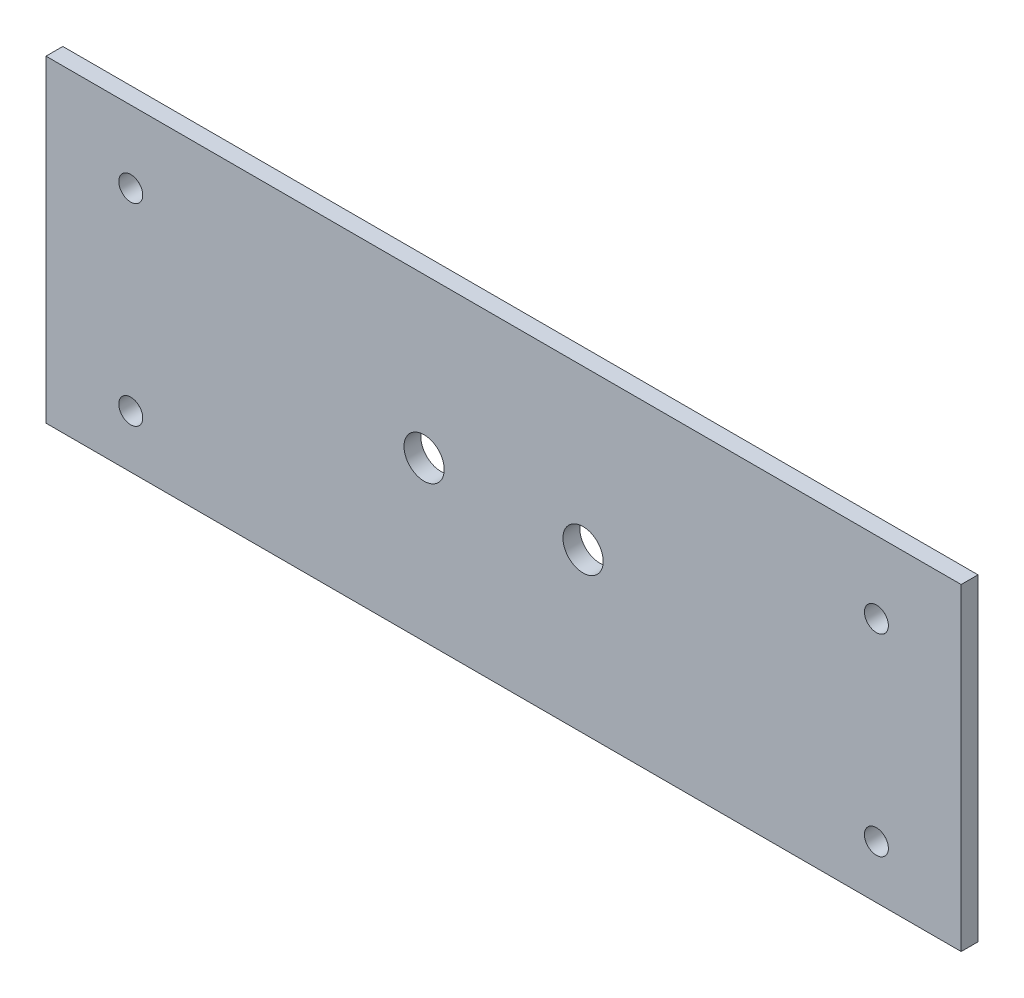
ISO-10303-21;
HEADER;
FILE_DESCRIPTION(('STEP AP214'),'2;1');
FILE_NAME('part.step','',(''),(''),'','','');
FILE_SCHEMA(('AUTOMOTIVE_DESIGN { 1 0 10303 214 1 1 1 1 }'));
ENDSEC;
DATA;
#1=APPLICATION_CONTEXT('core data for automotive mechanical design processes');
#2=APPLICATION_PROTOCOL_DEFINITION('international standard','automotive_design',2000,#1);
#3=PRODUCT_CONTEXT('',#1,'mechanical');
#4=PRODUCT('Part','Part','',(#3));
#5=PRODUCT_RELATED_PRODUCT_CATEGORY('part','',(#4));
#6=PRODUCT_DEFINITION_FORMATION('','',#4);
#7=PRODUCT_DEFINITION_CONTEXT('part definition',#1,'design');
#8=PRODUCT_DEFINITION('design','',#6,#7);
#9=PRODUCT_DEFINITION_SHAPE('','',#8);
#10=(LENGTH_UNIT() NAMED_UNIT(*) SI_UNIT(.MILLI.,.METRE.));
#11=(NAMED_UNIT(*) PLANE_ANGLE_UNIT() SI_UNIT($,.RADIAN.));
#12=(NAMED_UNIT(*) SI_UNIT($,.STERADIAN.) SOLID_ANGLE_UNIT());
#13=UNCERTAINTY_MEASURE_WITH_UNIT(LENGTH_MEASURE(1.E-05),#10,'distance_accuracy_value','');
#14=(GEOMETRIC_REPRESENTATION_CONTEXT(3) GLOBAL_UNCERTAINTY_ASSIGNED_CONTEXT((#13)) GLOBAL_UNIT_ASSIGNED_CONTEXT((#10,
#11,#12)) REPRESENTATION_CONTEXT('',''));
#15=CARTESIAN_POINT('',(0.,0.,0.));
#16=DIRECTION('',(0.,0.,1.));
#17=DIRECTION('',(1.,0.,0.));
#18=AXIS2_PLACEMENT_3D('',#15,#16,#17);
#19=CARTESIAN_POINT('',(-43.185,0.,1.5875));
#20=DIRECTION('',(1.,0.,0.));
#21=DIRECTION('',(0.,0.,-1.));
#22=AXIS2_PLACEMENT_3D('',#19,#20,#21);
#23=PLANE('',#22);
#24=DIRECTION('',(0.,-1.,0.));
#25=VECTOR('',#24,1.);
#26=CARTESIAN_POINT('',(-43.185,0.,0.));
#27=LINE('',#26,#25);
#28=CARTESIAN_POINT('',(-43.185,30.,0.));
#29=VERTEX_POINT('',#28);
#30=CARTESIAN_POINT('',(-43.185,0.,0.));
#31=VERTEX_POINT('',#30);
#32=EDGE_CURVE('E97',#29,#31,#27,.T.);
#33=ORIENTED_EDGE('',*,*,#32,.T.);
#34=DIRECTION('',(0.,0.,-1.));
#35=VECTOR('',#34,1.);
#36=CARTESIAN_POINT('',(-43.185,0.,1.5875));
#37=LINE('',#36,#35);
#38=CARTESIAN_POINT('',(-43.185,0.,1.5875));
#39=VERTEX_POINT('',#38);
#40=EDGE_CURVE('E11',#39,#31,#37,.T.);
#41=ORIENTED_EDGE('',*,*,#40,.F.);
#42=DIRECTION('',(0.,-1.,0.));
#43=VECTOR('',#42,1.);
#44=CARTESIAN_POINT('',(-43.185,0.,1.5875));
#45=LINE('',#44,#43);
#46=CARTESIAN_POINT('',(-43.185,30.,1.5875));
#47=VERTEX_POINT('',#46);
#48=EDGE_CURVE('E85',#47,#39,#45,.T.);
#49=ORIENTED_EDGE('',*,*,#48,.F.);
#50=DIRECTION('',(0.,0.,-1.));
#51=VECTOR('',#50,1.);
#52=CARTESIAN_POINT('',(-43.185,30.,1.5875));
#53=LINE('',#52,#51);
#54=EDGE_CURVE('E93',#47,#29,#53,.T.);
#55=ORIENTED_EDGE('',*,*,#54,.T.);
#56=EDGE_LOOP('',(#33,#41,#49,#55));
#57=FACE_BOUND('',#56,.T.);
#58=ADVANCED_FACE('F34',(#57),#23,.F.);
#59=CARTESIAN_POINT('',(-43.185,0.,1.5875));
#60=DIRECTION('',(0.,1.,0.));
#61=DIRECTION('',(0.,0.,1.));
#62=AXIS2_PLACEMENT_3D('',#59,#60,#61);
#63=PLANE('',#62);
#64=DIRECTION('',(1.,0.,0.));
#65=VECTOR('',#64,1.);
#66=CARTESIAN_POINT('',(-43.185,0.,0.));
#67=LINE('',#66,#65);
#68=CARTESIAN_POINT('',(43.185,0.,0.));
#69=VERTEX_POINT('',#68);
#70=EDGE_CURVE('E89',#31,#69,#67,.T.);
#71=ORIENTED_EDGE('',*,*,#70,.T.);
#72=DIRECTION('',(0.,0.,-1.));
#73=VECTOR('',#72,1.);
#74=CARTESIAN_POINT('',(43.185,0.,1.5875));
#75=LINE('',#74,#73);
#76=CARTESIAN_POINT('',(43.185,0.,1.5875));
#77=VERTEX_POINT('',#76);
#78=EDGE_CURVE('E42',#77,#69,#75,.T.);
#79=ORIENTED_EDGE('',*,*,#78,.F.);
#80=DIRECTION('',(1.,0.,0.));
#81=VECTOR('',#80,1.);
#82=CARTESIAN_POINT('',(-43.185,0.,1.5875));
#83=LINE('',#82,#81);
#84=EDGE_CURVE('E80',#39,#77,#83,.T.);
#85=ORIENTED_EDGE('',*,*,#84,.F.);
#86=ORIENTED_EDGE('',*,*,#40,.T.);
#87=EDGE_LOOP('',(#71,#79,#85,#86));
#88=FACE_BOUND('',#87,.T.);
#89=ADVANCED_FACE('F88',(#88),#63,.F.);
#90=CARTESIAN_POINT('',(43.185,0.,1.5875));
#91=DIRECTION('',(-1.,0.,0.));
#92=DIRECTION('',(0.,0.,1.));
#93=AXIS2_PLACEMENT_3D('',#90,#91,#92);
#94=PLANE('',#93);
#95=DIRECTION('',(0.,1.,0.));
#96=VECTOR('',#95,1.);
#97=CARTESIAN_POINT('',(43.185,0.,0.));
#98=LINE('',#97,#96);
#99=CARTESIAN_POINT('',(43.185,30.,0.));
#100=VERTEX_POINT('',#99);
#101=EDGE_CURVE('E67',#69,#100,#98,.T.);
#102=ORIENTED_EDGE('',*,*,#101,.T.);
#103=DIRECTION('',(0.,0.,-1.));
#104=VECTOR('',#103,1.);
#105=CARTESIAN_POINT('',(43.185,30.,1.5875));
#106=LINE('',#105,#104);
#107=CARTESIAN_POINT('',(43.185,30.,1.5875));
#108=VERTEX_POINT('',#107);
#109=EDGE_CURVE('E90',#108,#100,#106,.T.);
#110=ORIENTED_EDGE('',*,*,#109,.F.);
#111=DIRECTION('',(0.,1.,0.));
#112=VECTOR('',#111,1.);
#113=CARTESIAN_POINT('',(43.185,0.,1.5875));
#114=LINE('',#113,#112);
#115=EDGE_CURVE('E83',#77,#108,#114,.T.);
#116=ORIENTED_EDGE('',*,*,#115,.F.);
#117=ORIENTED_EDGE('',*,*,#78,.T.);
#118=EDGE_LOOP('',(#102,#110,#116,#117));
#119=FACE_BOUND('',#118,.T.);
#120=ADVANCED_FACE('F91',(#119),#94,.F.);
#121=CARTESIAN_POINT('',(-43.185,30.,1.5875));
#122=DIRECTION('',(0.,-1.,0.));
#123=DIRECTION('',(0.,0.,-1.));
#124=AXIS2_PLACEMENT_3D('',#121,#122,#123);
#125=PLANE('',#124);
#126=DIRECTION('',(-1.,0.,0.));
#127=VECTOR('',#126,1.);
#128=CARTESIAN_POINT('',(-43.185,30.,0.));
#129=LINE('',#128,#127);
#130=EDGE_CURVE('E73',#100,#29,#129,.T.);
#131=ORIENTED_EDGE('',*,*,#130,.T.);
#132=ORIENTED_EDGE('',*,*,#54,.F.);
#133=DIRECTION('',(-1.,0.,0.));
#134=VECTOR('',#133,1.);
#135=CARTESIAN_POINT('',(-43.185,30.,1.5875));
#136=LINE('',#135,#134);
#137=EDGE_CURVE('E50',#108,#47,#136,.T.);
#138=ORIENTED_EDGE('',*,*,#137,.F.);
#139=ORIENTED_EDGE('',*,*,#109,.T.);
#140=EDGE_LOOP('',(#131,#132,#138,#139));
#141=FACE_BOUND('',#140,.T.);
#142=ADVANCED_FACE('F105',(#141),#125,.F.);
#143=CARTESIAN_POINT('',(0.,0.,1.5875));
#144=DIRECTION('',(0.,0.,-1.));
#145=DIRECTION('',(-1.,0.,0.));
#146=AXIS2_PLACEMENT_3D('',#143,#144,#145);
#147=PLANE('',#146);
#148=CARTESIAN_POINT('',(-7.5,15.,1.5875));
#149=DIRECTION('',(0.,0.,-1.));
#150=DIRECTION('',(-1.,0.,0.));
#151=AXIS2_PLACEMENT_3D('',#148,#149,#150);
#152=CIRCLE('',#151,1.89865);
#153=CARTESIAN_POINT('',(-9.39865,15.,1.5875));
#154=VERTEX_POINT('',#153);
#155=EDGE_CURVE('E140',#154,#154,#152,.T.);
#156=ORIENTED_EDGE('',*,*,#155,.T.);
#157=EDGE_LOOP('',(#156));
#158=FACE_BOUND('',#157,.T.);
#159=CARTESIAN_POINT('',(7.5,15.,1.5875));
#160=DIRECTION('',(0.,0.,-1.));
#161=DIRECTION('',(-1.,0.,0.));
#162=AXIS2_PLACEMENT_3D('',#159,#160,#161);
#163=CIRCLE('',#162,1.89865);
#164=CARTESIAN_POINT('',(5.60135,15.,1.5875));
#165=VERTEX_POINT('',#164);
#166=EDGE_CURVE('E134',#165,#165,#163,.T.);
#167=ORIENTED_EDGE('',*,*,#166,.T.);
#168=EDGE_LOOP('',(#167));
#169=FACE_BOUND('',#168,.T.);
#170=CARTESIAN_POINT('',(35.185,23.2,1.5875));
#171=DIRECTION('',(0.,0.,1.));
#172=DIRECTION('',(1.,0.,0.));
#173=AXIS2_PLACEMENT_3D('',#170,#171,#172);
#174=CIRCLE('',#173,1.1303);
#175=CARTESIAN_POINT('',(36.3153,23.2,1.5875));
#176=VERTEX_POINT('',#175);
#177=EDGE_CURVE('E131',#176,#176,#174,.T.);
#178=ORIENTED_EDGE('',*,*,#177,.F.);
#179=EDGE_LOOP('',(#178));
#180=FACE_BOUND('',#179,.T.);
#181=CARTESIAN_POINT('',(35.185,5.,1.5875));
#182=DIRECTION('',(0.,0.,1.));
#183=DIRECTION('',(1.,0.,0.));
#184=AXIS2_PLACEMENT_3D('',#181,#182,#183);
#185=CIRCLE('',#184,1.1303);
#186=CARTESIAN_POINT('',(36.3153,5.,1.5875));
#187=VERTEX_POINT('',#186);
#188=EDGE_CURVE('E125',#187,#187,#185,.T.);
#189=ORIENTED_EDGE('',*,*,#188,.F.);
#190=EDGE_LOOP('',(#189));
#191=FACE_BOUND('',#190,.T.);
#192=CARTESIAN_POINT('',(-35.185,5.,1.5875));
#193=DIRECTION('',(0.,0.,1.));
#194=DIRECTION('',(1.,0.,0.));
#195=AXIS2_PLACEMENT_3D('',#192,#193,#194);
#196=CIRCLE('',#195,1.1303);
#197=CARTESIAN_POINT('',(-34.0547,5.,1.5875));
#198=VERTEX_POINT('',#197);
#199=EDGE_CURVE('E119',#198,#198,#196,.T.);
#200=ORIENTED_EDGE('',*,*,#199,.F.);
#201=EDGE_LOOP('',(#200));
#202=FACE_BOUND('',#201,.T.);
#203=CARTESIAN_POINT('',(-35.185,23.2,1.5875));
#204=DIRECTION('',(0.,0.,1.));
#205=DIRECTION('',(1.,0.,0.));
#206=AXIS2_PLACEMENT_3D('',#203,#204,#205);
#207=CIRCLE('',#206,1.1303);
#208=CARTESIAN_POINT('',(-34.0547,23.2,1.5875));
#209=VERTEX_POINT('',#208);
#210=EDGE_CURVE('E113',#209,#209,#207,.T.);
#211=ORIENTED_EDGE('',*,*,#210,.F.);
#212=EDGE_LOOP('',(#211));
#213=FACE_BOUND('',#212,.T.);
#214=ORIENTED_EDGE('',*,*,#48,.T.);
#215=ORIENTED_EDGE('',*,*,#84,.T.);
#216=ORIENTED_EDGE('',*,*,#115,.T.);
#217=ORIENTED_EDGE('',*,*,#137,.T.);
#218=EDGE_LOOP('',(#214,#215,#216,#217));
#219=FACE_BOUND('',#218,.T.);
#220=ADVANCED_FACE('F81',(#158,#169,#180,#191,#202,#213,#219),#147,.F.);
#221=CARTESIAN_POINT('',(0.,0.,0.));
#222=DIRECTION('',(0.,0.,-1.));
#223=DIRECTION('',(-1.,0.,0.));
#224=AXIS2_PLACEMENT_3D('',#221,#222,#223);
#225=PLANE('',#224);
#226=CARTESIAN_POINT('',(-7.5,15.,0.));
#227=DIRECTION('',(0.,0.,-1.));
#228=DIRECTION('',(-1.,0.,0.));
#229=AXIS2_PLACEMENT_3D('',#226,#227,#228);
#230=CIRCLE('',#229,1.89865);
#231=CARTESIAN_POINT('',(-9.39865,15.,0.));
#232=VERTEX_POINT('',#231);
#233=EDGE_CURVE('E143',#232,#232,#230,.T.);
#234=ORIENTED_EDGE('',*,*,#233,.F.);
#235=EDGE_LOOP('',(#234));
#236=FACE_BOUND('',#235,.T.);
#237=CARTESIAN_POINT('',(7.5,15.,0.));
#238=DIRECTION('',(0.,0.,-1.));
#239=DIRECTION('',(-1.,0.,0.));
#240=AXIS2_PLACEMENT_3D('',#237,#238,#239);
#241=CIRCLE('',#240,1.89865);
#242=CARTESIAN_POINT('',(5.60135,15.,0.));
#243=VERTEX_POINT('',#242);
#244=EDGE_CURVE('E137',#243,#243,#241,.T.);
#245=ORIENTED_EDGE('',*,*,#244,.F.);
#246=EDGE_LOOP('',(#245));
#247=FACE_BOUND('',#246,.T.);
#248=CARTESIAN_POINT('',(35.185,23.2,0.));
#249=DIRECTION('',(0.,0.,1.));
#250=DIRECTION('',(1.,0.,0.));
#251=AXIS2_PLACEMENT_3D('',#248,#249,#250);
#252=CIRCLE('',#251,1.1303);
#253=CARTESIAN_POINT('',(36.3153,23.2,0.));
#254=VERTEX_POINT('',#253);
#255=EDGE_CURVE('E128',#254,#254,#252,.T.);
#256=ORIENTED_EDGE('',*,*,#255,.T.);
#257=EDGE_LOOP('',(#256));
#258=FACE_BOUND('',#257,.T.);
#259=CARTESIAN_POINT('',(35.185,5.,0.));
#260=DIRECTION('',(0.,0.,1.));
#261=DIRECTION('',(1.,0.,0.));
#262=AXIS2_PLACEMENT_3D('',#259,#260,#261);
#263=CIRCLE('',#262,1.1303);
#264=CARTESIAN_POINT('',(36.3153,5.,0.));
#265=VERTEX_POINT('',#264);
#266=EDGE_CURVE('E122',#265,#265,#263,.T.);
#267=ORIENTED_EDGE('',*,*,#266,.T.);
#268=EDGE_LOOP('',(#267));
#269=FACE_BOUND('',#268,.T.);
#270=CARTESIAN_POINT('',(-35.185,5.,0.));
#271=DIRECTION('',(0.,0.,1.));
#272=DIRECTION('',(1.,0.,0.));
#273=AXIS2_PLACEMENT_3D('',#270,#271,#272);
#274=CIRCLE('',#273,1.1303);
#275=CARTESIAN_POINT('',(-34.0547,5.,0.));
#276=VERTEX_POINT('',#275);
#277=EDGE_CURVE('E116',#276,#276,#274,.T.);
#278=ORIENTED_EDGE('',*,*,#277,.T.);
#279=EDGE_LOOP('',(#278));
#280=FACE_BOUND('',#279,.T.);
#281=CARTESIAN_POINT('',(-35.185,23.2,0.));
#282=DIRECTION('',(0.,0.,1.));
#283=DIRECTION('',(1.,0.,0.));
#284=AXIS2_PLACEMENT_3D('',#281,#282,#283);
#285=CIRCLE('',#284,1.1303);
#286=CARTESIAN_POINT('',(-34.0547,23.2,0.));
#287=VERTEX_POINT('',#286);
#288=EDGE_CURVE('E100',#287,#287,#285,.T.);
#289=ORIENTED_EDGE('',*,*,#288,.T.);
#290=EDGE_LOOP('',(#289));
#291=FACE_BOUND('',#290,.T.);
#292=ORIENTED_EDGE('',*,*,#32,.F.);
#293=ORIENTED_EDGE('',*,*,#130,.F.);
#294=ORIENTED_EDGE('',*,*,#101,.F.);
#295=ORIENTED_EDGE('',*,*,#70,.F.);
#296=EDGE_LOOP('',(#292,#293,#294,#295));
#297=FACE_BOUND('',#296,.T.);
#298=ADVANCED_FACE('F108',(#236,#247,#258,#269,#280,#291,#297),#225,.T.);
#299=CARTESIAN_POINT('',(-35.185,23.2,1.5875));
#300=DIRECTION('',(0.,0.,1.));
#301=DIRECTION('',(1.,0.,0.));
#302=AXIS2_PLACEMENT_3D('',#299,#300,#301);
#303=CYLINDRICAL_SURFACE('',#302,1.1303);
#304=ORIENTED_EDGE('',*,*,#288,.F.);
#305=EDGE_LOOP('',(#304));
#306=FACE_BOUND('',#305,.T.);
#307=ORIENTED_EDGE('',*,*,#210,.T.);
#308=EDGE_LOOP('',(#307));
#309=FACE_BOUND('',#308,.T.);
#310=ADVANCED_FACE('F151',(#306,#309),#303,.F.);
#311=CARTESIAN_POINT('',(-35.185,5.,1.5875));
#312=DIRECTION('',(0.,0.,1.));
#313=DIRECTION('',(1.,0.,0.));
#314=AXIS2_PLACEMENT_3D('',#311,#312,#313);
#315=CYLINDRICAL_SURFACE('',#314,1.1303);
#316=ORIENTED_EDGE('',*,*,#277,.F.);
#317=EDGE_LOOP('',(#316));
#318=FACE_BOUND('',#317,.T.);
#319=ORIENTED_EDGE('',*,*,#199,.T.);
#320=EDGE_LOOP('',(#319));
#321=FACE_BOUND('',#320,.T.);
#322=ADVANCED_FACE('F165',(#318,#321),#315,.F.);
#323=CARTESIAN_POINT('',(35.185,5.,1.5875));
#324=DIRECTION('',(0.,0.,1.));
#325=DIRECTION('',(1.,0.,0.));
#326=AXIS2_PLACEMENT_3D('',#323,#324,#325);
#327=CYLINDRICAL_SURFACE('',#326,1.1303);
#328=ORIENTED_EDGE('',*,*,#266,.F.);
#329=EDGE_LOOP('',(#328));
#330=FACE_BOUND('',#329,.T.);
#331=ORIENTED_EDGE('',*,*,#188,.T.);
#332=EDGE_LOOP('',(#331));
#333=FACE_BOUND('',#332,.T.);
#334=ADVANCED_FACE('F213',(#330,#333),#327,.F.);
#335=CARTESIAN_POINT('',(35.185,23.2,1.5875));
#336=DIRECTION('',(0.,0.,1.));
#337=DIRECTION('',(1.,0.,0.));
#338=AXIS2_PLACEMENT_3D('',#335,#336,#337);
#339=CYLINDRICAL_SURFACE('',#338,1.1303);
#340=ORIENTED_EDGE('',*,*,#255,.F.);
#341=EDGE_LOOP('',(#340));
#342=FACE_BOUND('',#341,.T.);
#343=ORIENTED_EDGE('',*,*,#177,.T.);
#344=EDGE_LOOP('',(#343));
#345=FACE_BOUND('',#344,.T.);
#346=ADVANCED_FACE('F221',(#342,#345),#339,.F.);
#347=CARTESIAN_POINT('',(7.5,15.,0.));
#348=DIRECTION('',(0.,0.,-1.));
#349=DIRECTION('',(-1.,0.,0.));
#350=AXIS2_PLACEMENT_3D('',#347,#348,#349);
#351=CYLINDRICAL_SURFACE('',#350,1.89865);
#352=ORIENTED_EDGE('',*,*,#166,.F.);
#353=EDGE_LOOP('',(#352));
#354=FACE_BOUND('',#353,.T.);
#355=ORIENTED_EDGE('',*,*,#244,.T.);
#356=EDGE_LOOP('',(#355));
#357=FACE_BOUND('',#356,.T.);
#358=ADVANCED_FACE('F228',(#354,#357),#351,.F.);
#359=CARTESIAN_POINT('',(-7.5,15.,0.));
#360=DIRECTION('',(0.,0.,-1.));
#361=DIRECTION('',(-1.,0.,0.));
#362=AXIS2_PLACEMENT_3D('',#359,#360,#361);
#363=CYLINDRICAL_SURFACE('',#362,1.89865);
#364=ORIENTED_EDGE('',*,*,#155,.F.);
#365=EDGE_LOOP('',(#364));
#366=FACE_BOUND('',#365,.T.);
#367=ORIENTED_EDGE('',*,*,#233,.T.);
#368=EDGE_LOOP('',(#367));
#369=FACE_BOUND('',#368,.T.);
#370=ADVANCED_FACE('F147',(#366,#369),#363,.F.);
#371=CLOSED_SHELL('',(#58,#89,#120,#142,#220,#298,#310,#322,#334,#346,#358,#370));
#372=MANIFOLD_SOLID_BREP('B2',#371);
#373=ADVANCED_BREP_SHAPE_REPRESENTATION('',(#18,#372),#14);
#374=SHAPE_DEFINITION_REPRESENTATION(#9,#373);
ENDSEC;
END-ISO-10303-21;
